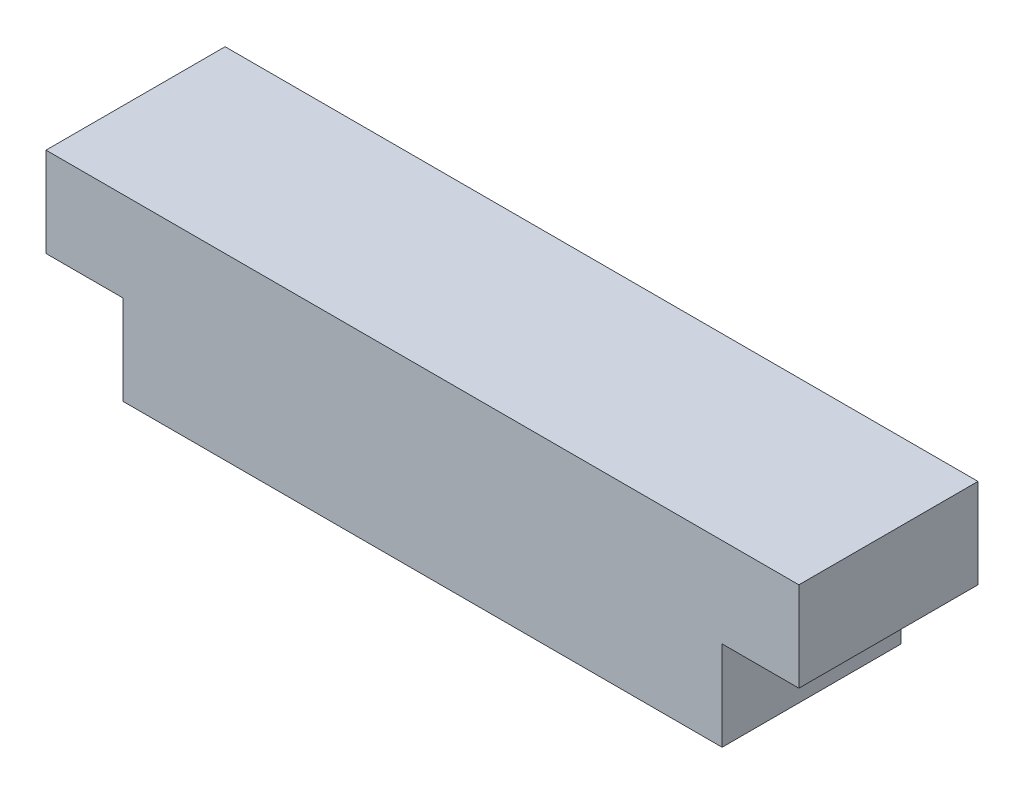
ISO-10303-21;
HEADER;
FILE_DESCRIPTION(('STEP AP214'),'2;1');
FILE_NAME('part.step','',(''),(''),'','','');
FILE_SCHEMA(('AUTOMOTIVE_DESIGN { 1 0 10303 214 1 1 1 1 }'));
ENDSEC;
DATA;
#1=APPLICATION_CONTEXT('core data for automotive mechanical design processes');
#2=APPLICATION_PROTOCOL_DEFINITION('international standard','automotive_design',2000,#1);
#3=PRODUCT_CONTEXT('',#1,'mechanical');
#4=PRODUCT('Part','Part','',(#3));
#5=PRODUCT_RELATED_PRODUCT_CATEGORY('part','',(#4));
#6=PRODUCT_DEFINITION_FORMATION('','',#4);
#7=PRODUCT_DEFINITION_CONTEXT('part definition',#1,'design');
#8=PRODUCT_DEFINITION('design','',#6,#7);
#9=PRODUCT_DEFINITION_SHAPE('','',#8);
#10=(LENGTH_UNIT() NAMED_UNIT(*) SI_UNIT(.MILLI.,.METRE.));
#11=(NAMED_UNIT(*) PLANE_ANGLE_UNIT() SI_UNIT($,.RADIAN.));
#12=(NAMED_UNIT(*) SI_UNIT($,.STERADIAN.) SOLID_ANGLE_UNIT());
#13=UNCERTAINTY_MEASURE_WITH_UNIT(LENGTH_MEASURE(1.E-05),#10,'distance_accuracy_value','');
#14=(GEOMETRIC_REPRESENTATION_CONTEXT(3) GLOBAL_UNCERTAINTY_ASSIGNED_CONTEXT((#13)) GLOBAL_UNIT_ASSIGNED_CONTEXT((#10,
#11,#12)) REPRESENTATION_CONTEXT('',''));
#15=CARTESIAN_POINT('',(0.,0.,0.));
#16=DIRECTION('',(0.,0.,1.));
#17=DIRECTION('',(1.,0.,0.));
#18=AXIS2_PLACEMENT_3D('',#15,#16,#17);
#19=CARTESIAN_POINT('',(21.25,-3.175,12.7));
#20=DIRECTION('',(-1.,0.,0.));
#21=DIRECTION('',(0.,0.,1.));
#22=AXIS2_PLACEMENT_3D('',#19,#20,#21);
#23=PLANE('',#22);
#24=DIRECTION('',(0.,1.,0.));
#25=VECTOR('',#24,1.);
#26=CARTESIAN_POINT('',(21.25,-3.175,0.));
#27=LINE('',#26,#25);
#28=CARTESIAN_POINT('',(21.25,-3.175,0.));
#29=VERTEX_POINT('',#28);
#30=CARTESIAN_POINT('',(21.25,3.175,0.));
#31=VERTEX_POINT('',#30);
#32=EDGE_CURVE('E154',#29,#31,#27,.T.);
#33=ORIENTED_EDGE('',*,*,#32,.T.);
#34=DIRECTION('',(0.,0.,-1.));
#35=VECTOR('',#34,1.);
#36=CARTESIAN_POINT('',(21.25,3.175,12.7));
#37=LINE('',#36,#35);
#38=CARTESIAN_POINT('',(21.25,3.175,12.7));
#39=VERTEX_POINT('',#38);
#40=EDGE_CURVE('E11',#39,#31,#37,.T.);
#41=ORIENTED_EDGE('',*,*,#40,.F.);
#42=DIRECTION('',(0.,1.,0.));
#43=VECTOR('',#42,1.);
#44=CARTESIAN_POINT('',(21.25,-3.175,12.7));
#45=LINE('',#44,#43);
#46=CARTESIAN_POINT('',(21.25,-3.175,12.7));
#47=VERTEX_POINT('',#46);
#48=EDGE_CURVE('E87',#47,#39,#45,.T.);
#49=ORIENTED_EDGE('',*,*,#48,.F.);
#50=DIRECTION('',(0.,0.,-1.));
#51=VECTOR('',#50,1.);
#52=CARTESIAN_POINT('',(21.25,-3.175,12.7));
#53=LINE('',#52,#51);
#54=EDGE_CURVE('E163',#47,#29,#53,.T.);
#55=ORIENTED_EDGE('',*,*,#54,.T.);
#56=EDGE_LOOP('',(#33,#41,#49,#55));
#57=FACE_BOUND('',#56,.T.);
#58=ADVANCED_FACE('F45',(#57),#23,.F.);
#59=CARTESIAN_POINT('',(-21.25,-3.175,12.7));
#60=DIRECTION('',(1.,0.,0.));
#61=DIRECTION('',(0.,0.,-1.));
#62=AXIS2_PLACEMENT_3D('',#59,#60,#61);
#63=PLANE('',#62);
#64=DIRECTION('',(0.,-1.,0.));
#65=VECTOR('',#64,1.);
#66=CARTESIAN_POINT('',(-21.25,-3.175,0.));
#67=LINE('',#66,#65);
#68=CARTESIAN_POINT('',(-21.25,3.175,0.));
#69=VERTEX_POINT('',#68);
#70=CARTESIAN_POINT('',(-21.25,-3.175,0.));
#71=VERTEX_POINT('',#70);
#72=EDGE_CURVE('E76',#69,#71,#67,.T.);
#73=ORIENTED_EDGE('',*,*,#72,.T.);
#74=DIRECTION('',(0.,0.,-1.));
#75=VECTOR('',#74,1.);
#76=CARTESIAN_POINT('',(-21.25,-3.175,12.7));
#77=LINE('',#76,#75);
#78=CARTESIAN_POINT('',(-21.25,-3.175,12.7));
#79=VERTEX_POINT('',#78);
#80=EDGE_CURVE('E172',#79,#71,#77,.T.);
#81=ORIENTED_EDGE('',*,*,#80,.F.);
#82=DIRECTION('',(0.,-1.,0.));
#83=VECTOR('',#82,1.);
#84=CARTESIAN_POINT('',(-21.25,-3.175,12.7));
#85=LINE('',#84,#83);
#86=CARTESIAN_POINT('',(-21.25,3.175,12.7));
#87=VERTEX_POINT('',#86);
#88=EDGE_CURVE('E158',#87,#79,#85,.T.);
#89=ORIENTED_EDGE('',*,*,#88,.F.);
#90=DIRECTION('',(0.,0.,-1.));
#91=VECTOR('',#90,1.);
#92=CARTESIAN_POINT('',(-21.25,3.175,12.7));
#93=LINE('',#92,#91);
#94=EDGE_CURVE('E54',#87,#69,#93,.T.);
#95=ORIENTED_EDGE('',*,*,#94,.T.);
#96=EDGE_LOOP('',(#73,#81,#89,#95));
#97=FACE_BOUND('',#96,.T.);
#98=ADVANCED_FACE('F176',(#97),#63,.F.);
#99=CARTESIAN_POINT('',(-21.25,-3.175,12.7));
#100=DIRECTION('',(0.,1.,0.));
#101=DIRECTION('',(0.,0.,1.));
#102=AXIS2_PLACEMENT_3D('',#99,#100,#101);
#103=PLANE('',#102);
#104=DIRECTION('',(1.,0.,0.));
#105=VECTOR('',#104,1.);
#106=CARTESIAN_POINT('',(-21.25,-3.175,0.));
#107=LINE('',#106,#105);
#108=EDGE_CURVE('E82',#71,#29,#107,.T.);
#109=ORIENTED_EDGE('',*,*,#108,.T.);
#110=ORIENTED_EDGE('',*,*,#54,.F.);
#111=DIRECTION('',(1.,0.,0.));
#112=VECTOR('',#111,1.);
#113=CARTESIAN_POINT('',(-21.25,-3.175,12.7));
#114=LINE('',#113,#112);
#115=EDGE_CURVE('E62',#79,#47,#114,.T.);
#116=ORIENTED_EDGE('',*,*,#115,.F.);
#117=ORIENTED_EDGE('',*,*,#80,.T.);
#118=EDGE_LOOP('',(#109,#110,#116,#117));
#119=FACE_BOUND('',#118,.T.);
#120=ADVANCED_FACE('F212',(#119),#103,.F.);
#121=CARTESIAN_POINT('',(0.,0.,12.7));
#122=DIRECTION('',(0.,0.,-1.));
#123=DIRECTION('',(-1.,0.,0.));
#124=AXIS2_PLACEMENT_3D('',#121,#122,#123);
#125=PLANE('',#124);
#126=ORIENTED_EDGE('',*,*,#48,.T.);
#127=DIRECTION('',(1.,0.,0.));
#128=VECTOR('',#127,1.);
#129=CARTESIAN_POINT('',(-26.69375,3.175,12.7));
#130=LINE('',#129,#128);
#131=CARTESIAN_POINT('',(26.69375,3.175,12.7));
#132=VERTEX_POINT('',#131);
#133=EDGE_CURVE('E202',#39,#132,#130,.T.);
#134=ORIENTED_EDGE('',*,*,#133,.T.);
#135=DIRECTION('',(0.,1.,0.));
#136=VECTOR('',#135,1.);
#137=CARTESIAN_POINT('',(26.69375,3.175,12.7));
#138=LINE('',#137,#136);
#139=CARTESIAN_POINT('',(26.69375,9.525,12.7));
#140=VERTEX_POINT('',#139);
#141=EDGE_CURVE('E143',#132,#140,#138,.T.);
#142=ORIENTED_EDGE('',*,*,#141,.T.);
#143=DIRECTION('',(-1.,0.,0.));
#144=VECTOR('',#143,1.);
#145=CARTESIAN_POINT('',(-26.69375,9.525,12.7));
#146=LINE('',#145,#144);
#147=CARTESIAN_POINT('',(-26.69375,9.525,12.7));
#148=VERTEX_POINT('',#147);
#149=EDGE_CURVE('E129',#140,#148,#146,.T.);
#150=ORIENTED_EDGE('',*,*,#149,.T.);
#151=DIRECTION('',(0.,-1.,0.));
#152=VECTOR('',#151,1.);
#153=CARTESIAN_POINT('',(-26.69375,3.175,12.7));
#154=LINE('',#153,#152);
#155=CARTESIAN_POINT('',(-26.69375,3.175,12.7));
#156=VERTEX_POINT('',#155);
#157=EDGE_CURVE('E189',#148,#156,#154,.T.);
#158=ORIENTED_EDGE('',*,*,#157,.T.);
#159=EDGE_CURVE('E183',#156,#87,#130,.T.);
#160=ORIENTED_EDGE('',*,*,#159,.T.);
#161=ORIENTED_EDGE('',*,*,#88,.T.);
#162=ORIENTED_EDGE('',*,*,#115,.T.);
#163=EDGE_LOOP('',(#126,#134,#142,#150,#158,#160,#161,#162));
#164=FACE_BOUND('',#163,.T.);
#165=ADVANCED_FACE('F201',(#164),#125,.F.);
#166=CARTESIAN_POINT('',(0.,0.,0.));
#167=DIRECTION('',(0.,0.,-1.));
#168=DIRECTION('',(-1.,0.,0.));
#169=AXIS2_PLACEMENT_3D('',#166,#167,#168);
#170=PLANE('',#169);
#171=ORIENTED_EDGE('',*,*,#32,.F.);
#172=ORIENTED_EDGE('',*,*,#108,.F.);
#173=ORIENTED_EDGE('',*,*,#72,.F.);
#174=DIRECTION('',(1.,0.,0.));
#175=VECTOR('',#174,1.);
#176=CARTESIAN_POINT('',(-26.69375,3.175,0.));
#177=LINE('',#176,#175);
#178=CARTESIAN_POINT('',(-26.69375,3.175,0.));
#179=VERTEX_POINT('',#178);
#180=EDGE_CURVE('E128',#179,#69,#177,.T.);
#181=ORIENTED_EDGE('',*,*,#180,.F.);
#182=DIRECTION('',(0.,-1.,0.));
#183=VECTOR('',#182,1.);
#184=CARTESIAN_POINT('',(-26.69375,3.175,0.));
#185=LINE('',#184,#183);
#186=CARTESIAN_POINT('',(-26.69375,9.525,0.));
#187=VERTEX_POINT('',#186);
#188=EDGE_CURVE('E155',#187,#179,#185,.T.);
#189=ORIENTED_EDGE('',*,*,#188,.F.);
#190=DIRECTION('',(-1.,0.,0.));
#191=VECTOR('',#190,1.);
#192=CARTESIAN_POINT('',(-26.69375,9.525,0.));
#193=LINE('',#192,#191);
#194=CARTESIAN_POINT('',(26.69375,9.525,0.));
#195=VERTEX_POINT('',#194);
#196=EDGE_CURVE('E135',#195,#187,#193,.T.);
#197=ORIENTED_EDGE('',*,*,#196,.F.);
#198=DIRECTION('',(0.,1.,0.));
#199=VECTOR('',#198,1.);
#200=CARTESIAN_POINT('',(26.69375,3.175,0.));
#201=LINE('',#200,#199);
#202=CARTESIAN_POINT('',(26.69375,3.175,0.));
#203=VERTEX_POINT('',#202);
#204=EDGE_CURVE('E132',#203,#195,#201,.T.);
#205=ORIENTED_EDGE('',*,*,#204,.F.);
#206=EDGE_CURVE('E118',#31,#203,#177,.T.);
#207=ORIENTED_EDGE('',*,*,#206,.F.);
#208=EDGE_LOOP('',(#171,#172,#173,#181,#189,#197,#205,#207));
#209=FACE_BOUND('',#208,.T.);
#210=ADVANCED_FACE('F133',(#209),#170,.T.);
#211=CARTESIAN_POINT('',(-26.69375,3.175,-53.7638136319402));
#212=DIRECTION('',(0.,-1.,0.));
#213=DIRECTION('',(0.,0.,-1.));
#214=AXIS2_PLACEMENT_3D('',#211,#212,#213);
#215=PLANE('',#214);
#216=ORIENTED_EDGE('',*,*,#94,.F.);
#217=ORIENTED_EDGE('',*,*,#159,.F.);
#218=DIRECTION('',(0.,0.,1.));
#219=VECTOR('',#218,1.);
#220=CARTESIAN_POINT('',(-26.69375,3.175,-53.7638136319402));
#221=LINE('',#220,#219);
#222=EDGE_CURVE('E151',#179,#156,#221,.T.);
#223=ORIENTED_EDGE('',*,*,#222,.F.);
#224=ORIENTED_EDGE('',*,*,#180,.T.);
#225=EDGE_LOOP('',(#216,#217,#223,#224));
#226=FACE_BOUND('',#225,.T.);
#227=ADVANCED_FACE('F182',(#226),#215,.T.);
#228=ORIENTED_EDGE('',*,*,#133,.F.);
#229=ORIENTED_EDGE('',*,*,#40,.T.);
#230=ORIENTED_EDGE('',*,*,#206,.T.);
#231=DIRECTION('',(0.,0.,1.));
#232=VECTOR('',#231,1.);
#233=CARTESIAN_POINT('',(26.69375,3.175,-53.7638136319402));
#234=LINE('',#233,#232);
#235=EDGE_CURVE('E123',#203,#132,#234,.T.);
#236=ORIENTED_EDGE('',*,*,#235,.T.);
#237=EDGE_LOOP('',(#228,#229,#230,#236));
#238=FACE_BOUND('',#237,.T.);
#239=ADVANCED_FACE('F121',(#238),#215,.T.);
#240=CARTESIAN_POINT('',(26.69375,3.175,-53.7638136319402));
#241=DIRECTION('',(1.,0.,0.));
#242=DIRECTION('',(0.,0.,-1.));
#243=AXIS2_PLACEMENT_3D('',#240,#241,#242);
#244=PLANE('',#243);
#245=ORIENTED_EDGE('',*,*,#235,.F.);
#246=ORIENTED_EDGE('',*,*,#204,.T.);
#247=DIRECTION('',(0.,0.,1.));
#248=VECTOR('',#247,1.);
#249=CARTESIAN_POINT('',(26.69375,9.525,-53.7638136319402));
#250=LINE('',#249,#248);
#251=EDGE_CURVE('E139',#195,#140,#250,.T.);
#252=ORIENTED_EDGE('',*,*,#251,.T.);
#253=ORIENTED_EDGE('',*,*,#141,.F.);
#254=EDGE_LOOP('',(#245,#246,#252,#253));
#255=FACE_BOUND('',#254,.T.);
#256=ADVANCED_FACE('F141',(#255),#244,.T.);
#257=CARTESIAN_POINT('',(-26.69375,9.525,-53.7638136319402));
#258=DIRECTION('',(0.,1.,0.));
#259=DIRECTION('',(0.,0.,1.));
#260=AXIS2_PLACEMENT_3D('',#257,#258,#259);
#261=PLANE('',#260);
#262=ORIENTED_EDGE('',*,*,#251,.F.);
#263=ORIENTED_EDGE('',*,*,#196,.T.);
#264=DIRECTION('',(0.,0.,1.));
#265=VECTOR('',#264,1.);
#266=CARTESIAN_POINT('',(-26.69375,9.525,-53.7638136319402));
#267=LINE('',#266,#265);
#268=EDGE_CURVE('E191',#187,#148,#267,.T.);
#269=ORIENTED_EDGE('',*,*,#268,.T.);
#270=ORIENTED_EDGE('',*,*,#149,.F.);
#271=EDGE_LOOP('',(#262,#263,#269,#270));
#272=FACE_BOUND('',#271,.T.);
#273=ADVANCED_FACE('F205',(#272),#261,.T.);
#274=CARTESIAN_POINT('',(-26.69375,3.175,-53.7638136319402));
#275=DIRECTION('',(-1.,0.,0.));
#276=DIRECTION('',(0.,0.,1.));
#277=AXIS2_PLACEMENT_3D('',#274,#275,#276);
#278=PLANE('',#277);
#279=ORIENTED_EDGE('',*,*,#268,.F.);
#280=ORIENTED_EDGE('',*,*,#188,.T.);
#281=ORIENTED_EDGE('',*,*,#222,.T.);
#282=ORIENTED_EDGE('',*,*,#157,.F.);
#283=EDGE_LOOP('',(#279,#280,#281,#282));
#284=FACE_BOUND('',#283,.T.);
#285=ADVANCED_FACE('F188',(#284),#278,.T.);
#286=CLOSED_SHELL('',(#58,#98,#120,#165,#210,#227,#239,#256,#273,#285));
#287=MANIFOLD_SOLID_BREP('B2',#286);
#288=ADVANCED_BREP_SHAPE_REPRESENTATION('',(#18,#287),#14);
#289=SHAPE_DEFINITION_REPRESENTATION(#9,#288);
ENDSEC;
END-ISO-10303-21;
